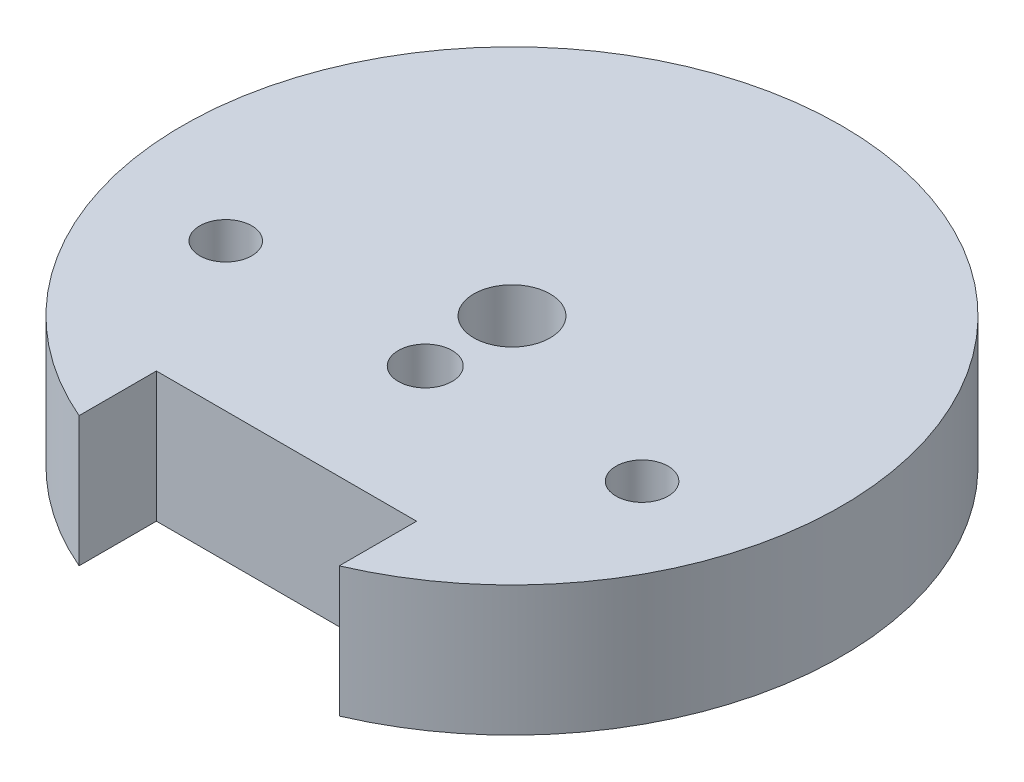
ISO-10303-21;
HEADER;
FILE_DESCRIPTION(('STEP AP214'),'2;1');
FILE_NAME('part.step','',(''),(''),'','','');
FILE_SCHEMA(('AUTOMOTIVE_DESIGN { 1 0 10303 214 1 1 1 1 }'));
ENDSEC;
DATA;
#1=APPLICATION_CONTEXT('core data for automotive mechanical design processes');
#2=APPLICATION_PROTOCOL_DEFINITION('international standard','automotive_design',2000,#1);
#3=PRODUCT_CONTEXT('',#1,'mechanical');
#4=PRODUCT('Part','Part','',(#3));
#5=PRODUCT_RELATED_PRODUCT_CATEGORY('part','',(#4));
#6=PRODUCT_DEFINITION_FORMATION('','',#4);
#7=PRODUCT_DEFINITION_CONTEXT('part definition',#1,'design');
#8=PRODUCT_DEFINITION('design','',#6,#7);
#9=PRODUCT_DEFINITION_SHAPE('','',#8);
#10=(LENGTH_UNIT() NAMED_UNIT(*) SI_UNIT(.MILLI.,.METRE.));
#11=(NAMED_UNIT(*) PLANE_ANGLE_UNIT() SI_UNIT($,.RADIAN.));
#12=(NAMED_UNIT(*) SI_UNIT($,.STERADIAN.) SOLID_ANGLE_UNIT());
#13=UNCERTAINTY_MEASURE_WITH_UNIT(LENGTH_MEASURE(1.E-05),#10,'distance_accuracy_value','');
#14=(GEOMETRIC_REPRESENTATION_CONTEXT(3) GLOBAL_UNCERTAINTY_ASSIGNED_CONTEXT((#13)) GLOBAL_UNIT_ASSIGNED_CONTEXT((#10,
#11,#12)) REPRESENTATION_CONTEXT('',''));
#15=CARTESIAN_POINT('',(0.,0.,0.));
#16=DIRECTION('',(0.,0.,1.));
#17=DIRECTION('',(1.,0.,0.));
#18=AXIS2_PLACEMENT_3D('',#15,#16,#17);
#19=CARTESIAN_POINT('',(0.,19.05,0.));
#20=DIRECTION('',(0.,1.,0.));
#21=DIRECTION('',(0.,0.,1.));
#22=AXIS2_PLACEMENT_3D('',#19,#20,#21);
#23=PLANE('',#22);
#24=CARTESIAN_POINT('',(30.48,19.05,11.43));
#25=DIRECTION('',(0.,1.,0.));
#26=DIRECTION('',(0.,0.,1.));
#27=AXIS2_PLACEMENT_3D('',#24,#25,#26);
#28=CIRCLE('',#27,3.81000000000002);
#29=CARTESIAN_POINT('',(30.48,19.05,7.61999999999997));
#30=VERTEX_POINT('',#29);
#31=EDGE_CURVE('E83',#30,#30,#28,.F.);
#32=ORIENTED_EDGE('',*,*,#31,.T.);
#33=EDGE_LOOP('',(#32));
#34=FACE_BOUND('',#33,.T.);
#35=CARTESIAN_POINT('',(-30.48,19.05,11.43));
#36=DIRECTION('',(0.,1.,0.));
#37=DIRECTION('',(0.,0.,1.));
#38=AXIS2_PLACEMENT_3D('',#35,#36,#37);
#39=CIRCLE('',#38,3.81000000000001);
#40=CARTESIAN_POINT('',(-30.48,19.05,7.61999999999999));
#41=VERTEX_POINT('',#40);
#42=EDGE_CURVE('E136',#41,#41,#39,.T.);
#43=ORIENTED_EDGE('',*,*,#42,.F.);
#44=EDGE_LOOP('',(#43));
#45=FACE_BOUND('',#44,.T.);
#46=CARTESIAN_POINT('',(0.,19.05,0.));
#47=DIRECTION('',(0.,1.,0.));
#48=DIRECTION('',(0.,0.,1.));
#49=AXIS2_PLACEMENT_3D('',#46,#47,#48);
#50=CIRCLE('',#49,5.588);
#51=CARTESIAN_POINT('',(0.,19.05,-5.588));
#52=VERTEX_POINT('',#51);
#53=EDGE_CURVE('E132',#52,#52,#50,.T.);
#54=ORIENTED_EDGE('',*,*,#53,.F.);
#55=EDGE_LOOP('',(#54));
#56=FACE_BOUND('',#55,.T.);
#57=CARTESIAN_POINT('',(0.,19.05,12.7));
#58=DIRECTION('',(0.,1.,0.));
#59=DIRECTION('',(0.,0.,1.));
#60=AXIS2_PLACEMENT_3D('',#57,#58,#59);
#61=CIRCLE('',#60,3.937);
#62=CARTESIAN_POINT('',(0.,19.05,8.763));
#63=VERTEX_POINT('',#62);
#64=EDGE_CURVE('E112',#63,#63,#61,.T.);
#65=ORIENTED_EDGE('',*,*,#64,.F.);
#66=EDGE_LOOP('',(#65));
#67=FACE_BOUND('',#66,.T.);
#68=CARTESIAN_POINT('',(0.,19.05,0.));
#69=DIRECTION('',(0.,1.,0.));
#70=DIRECTION('',(0.,0.,1.));
#71=AXIS2_PLACEMENT_3D('',#68,#69,#70);
#72=CIRCLE('',#71,48.26);
#73=CARTESIAN_POINT('',(-19.05,19.05,44.3410092352441));
#74=VERTEX_POINT('',#73);
#75=CARTESIAN_POINT('',(19.05,19.05,44.3410092352441));
#76=VERTEX_POINT('',#75);
#77=EDGE_CURVE('E151',#74,#76,#72,.F.);
#78=ORIENTED_EDGE('',*,*,#77,.F.);
#79=DIRECTION('',(0.,0.,1.));
#80=VECTOR('',#79,1.);
#81=CARTESIAN_POINT('',(-19.05,19.05,0.));
#82=LINE('',#81,#80);
#83=CARTESIAN_POINT('',(-19.05,19.05,33.02));
#84=VERTEX_POINT('',#83);
#85=EDGE_CURVE('E121',#84,#74,#82,.T.);
#86=ORIENTED_EDGE('',*,*,#85,.F.);
#87=DIRECTION('',(-1.,0.,0.));
#88=VECTOR('',#87,1.);
#89=CARTESIAN_POINT('',(0.,19.05,33.02));
#90=LINE('',#89,#88);
#91=CARTESIAN_POINT('',(19.05,19.05,33.02));
#92=VERTEX_POINT('',#91);
#93=EDGE_CURVE('E129',#92,#84,#90,.T.);
#94=ORIENTED_EDGE('',*,*,#93,.F.);
#95=DIRECTION('',(0.,0.,1.));
#96=VECTOR('',#95,1.);
#97=CARTESIAN_POINT('',(19.05,19.05,0.));
#98=LINE('',#97,#96);
#99=EDGE_CURVE('E80',#92,#76,#98,.T.);
#100=ORIENTED_EDGE('',*,*,#99,.T.);
#101=EDGE_LOOP('',(#78,#86,#94,#100));
#102=FACE_BOUND('',#101,.T.);
#103=ADVANCED_FACE('F41',(#34,#45,#56,#67,#102),#23,.T.);
#104=CARTESIAN_POINT('',(0.,0.,0.));
#105=DIRECTION('',(0.,1.,0.));
#106=DIRECTION('',(0.,0.,1.));
#107=AXIS2_PLACEMENT_3D('',#104,#105,#106);
#108=PLANE('',#107);
#109=CARTESIAN_POINT('',(0.,0.,12.7));
#110=DIRECTION('',(0.,1.,0.));
#111=DIRECTION('',(0.,0.,1.));
#112=AXIS2_PLACEMENT_3D('',#109,#110,#111);
#113=CIRCLE('',#112,3.937);
#114=CARTESIAN_POINT('',(0.,0.,8.763));
#115=VERTEX_POINT('',#114);
#116=EDGE_CURVE('E92',#115,#115,#113,.T.);
#117=ORIENTED_EDGE('',*,*,#116,.T.);
#118=EDGE_LOOP('',(#117));
#119=FACE_BOUND('',#118,.T.);
#120=CARTESIAN_POINT('',(0.,0.,0.));
#121=DIRECTION('',(0.,1.,0.));
#122=DIRECTION('',(0.,0.,1.));
#123=AXIS2_PLACEMENT_3D('',#120,#121,#122);
#124=CIRCLE('',#123,5.588);
#125=CARTESIAN_POINT('',(0.,0.,-5.588));
#126=VERTEX_POINT('',#125);
#127=EDGE_CURVE('E97',#126,#126,#124,.T.);
#128=ORIENTED_EDGE('',*,*,#127,.T.);
#129=EDGE_LOOP('',(#128));
#130=FACE_BOUND('',#129,.T.);
#131=CARTESIAN_POINT('',(-30.48,0.,11.43));
#132=DIRECTION('',(0.,1.,0.));
#133=DIRECTION('',(0.,0.,1.));
#134=AXIS2_PLACEMENT_3D('',#131,#132,#133);
#135=CIRCLE('',#134,3.81000000000001);
#136=CARTESIAN_POINT('',(-30.48,0.,7.61999999999999));
#137=VERTEX_POINT('',#136);
#138=EDGE_CURVE('E102',#137,#137,#135,.T.);
#139=ORIENTED_EDGE('',*,*,#138,.T.);
#140=EDGE_LOOP('',(#139));
#141=FACE_BOUND('',#140,.T.);
#142=CARTESIAN_POINT('',(30.48,0.,11.43));
#143=DIRECTION('',(0.,1.,0.));
#144=DIRECTION('',(0.,0.,1.));
#145=AXIS2_PLACEMENT_3D('',#142,#143,#144);
#146=CIRCLE('',#145,3.81000000000002);
#147=CARTESIAN_POINT('',(30.48,0.,7.61999999999997));
#148=VERTEX_POINT('',#147);
#149=EDGE_CURVE('E109',#148,#148,#146,.F.);
#150=ORIENTED_EDGE('',*,*,#149,.F.);
#151=EDGE_LOOP('',(#150));
#152=FACE_BOUND('',#151,.T.);
#153=DIRECTION('',(0.,0.,1.));
#154=VECTOR('',#153,1.);
#155=CARTESIAN_POINT('',(-19.05,0.,0.));
#156=LINE('',#155,#154);
#157=CARTESIAN_POINT('',(-19.05,0.,33.02));
#158=VERTEX_POINT('',#157);
#159=CARTESIAN_POINT('',(-19.05,0.,44.3410092352441));
#160=VERTEX_POINT('',#159);
#161=EDGE_CURVE('E91',#158,#160,#156,.T.);
#162=ORIENTED_EDGE('',*,*,#161,.T.);
#163=CARTESIAN_POINT('',(0.,0.,0.));
#164=DIRECTION('',(0.,1.,0.));
#165=DIRECTION('',(0.,0.,1.));
#166=AXIS2_PLACEMENT_3D('',#163,#164,#165);
#167=CIRCLE('',#166,48.26);
#168=CARTESIAN_POINT('',(19.05,0.,44.3410092352441));
#169=VERTEX_POINT('',#168);
#170=EDGE_CURVE('E89',#169,#160,#167,.T.);
#171=ORIENTED_EDGE('',*,*,#170,.F.);
#172=DIRECTION('',(0.,0.,1.));
#173=VECTOR('',#172,1.);
#174=CARTESIAN_POINT('',(19.05,0.,0.));
#175=LINE('',#174,#173);
#176=CARTESIAN_POINT('',(19.05,0.,33.02));
#177=VERTEX_POINT('',#176);
#178=EDGE_CURVE('E78',#177,#169,#175,.T.);
#179=ORIENTED_EDGE('',*,*,#178,.F.);
#180=DIRECTION('',(-1.,0.,0.));
#181=VECTOR('',#180,1.);
#182=CARTESIAN_POINT('',(0.,0.,33.02));
#183=LINE('',#182,#181);
#184=EDGE_CURVE('E88',#177,#158,#183,.T.);
#185=ORIENTED_EDGE('',*,*,#184,.T.);
#186=EDGE_LOOP('',(#162,#171,#179,#185));
#187=FACE_BOUND('',#186,.T.);
#188=ADVANCED_FACE('F87',(#119,#130,#141,#152,#187),#108,.F.);
#189=CARTESIAN_POINT('',(19.05,19.05,0.));
#190=DIRECTION('',(1.,0.,0.));
#191=DIRECTION('',(0.,0.,-1.));
#192=AXIS2_PLACEMENT_3D('',#189,#190,#191);
#193=PLANE('',#192);
#194=ORIENTED_EDGE('',*,*,#178,.T.);
#195=DIRECTION('',(0.,-1.,0.));
#196=VECTOR('',#195,1.);
#197=CARTESIAN_POINT('',(19.05,63.5,44.3410092352441));
#198=LINE('',#197,#196);
#199=EDGE_CURVE('E57',#169,#76,#198,.F.);
#200=ORIENTED_EDGE('',*,*,#199,.T.);
#201=ORIENTED_EDGE('',*,*,#99,.F.);
#202=DIRECTION('',(0.,-1.,0.));
#203=VECTOR('',#202,1.);
#204=CARTESIAN_POINT('',(19.05,19.05,33.02));
#205=LINE('',#204,#203);
#206=EDGE_CURVE('E50',#92,#177,#205,.T.);
#207=ORIENTED_EDGE('',*,*,#206,.T.);
#208=EDGE_LOOP('',(#194,#200,#201,#207));
#209=FACE_BOUND('',#208,.T.);
#210=ADVANCED_FACE('F77',(#209),#193,.F.);
#211=CARTESIAN_POINT('',(-19.05,19.05,0.));
#212=DIRECTION('',(1.,0.,0.));
#213=DIRECTION('',(0.,0.,-1.));
#214=AXIS2_PLACEMENT_3D('',#211,#212,#213);
#215=PLANE('',#214);
#216=DIRECTION('',(0.,-1.,0.));
#217=VECTOR('',#216,1.);
#218=CARTESIAN_POINT('',(-19.05,63.5,44.3410092352441));
#219=LINE('',#218,#217);
#220=EDGE_CURVE('E148',#160,#74,#219,.F.);
#221=ORIENTED_EDGE('',*,*,#220,.F.);
#222=ORIENTED_EDGE('',*,*,#161,.F.);
#223=DIRECTION('',(0.,-1.,0.));
#224=VECTOR('',#223,1.);
#225=CARTESIAN_POINT('',(-19.05,19.05,33.02));
#226=LINE('',#225,#224);
#227=EDGE_CURVE('E11',#84,#158,#226,.T.);
#228=ORIENTED_EDGE('',*,*,#227,.F.);
#229=ORIENTED_EDGE('',*,*,#85,.T.);
#230=EDGE_LOOP('',(#221,#222,#228,#229));
#231=FACE_BOUND('',#230,.T.);
#232=ADVANCED_FACE('F163',(#231),#215,.T.);
#233=CARTESIAN_POINT('',(-30.48,19.05,11.43));
#234=DIRECTION('',(0.,-1.,0.));
#235=DIRECTION('',(0.,0.,-1.));
#236=AXIS2_PLACEMENT_3D('',#233,#234,#235);
#237=CYLINDRICAL_SURFACE('',#236,3.81000000000001);
#238=CARTESIAN_POINT('',(-30.48,19.05,7.61999999999999));
#239=CARTESIAN_POINT('',(-30.48,18.8515625,7.61999999999999));
#240=CARTESIAN_POINT('',(-30.48,18.653125,7.61999999999999));
#241=CARTESIAN_POINT('',(-30.48,18.25625,7.61999999999999));
#242=CARTESIAN_POINT('',(-30.48,18.0578125,7.61999999999999));
#243=CARTESIAN_POINT('',(-30.48,17.6609375,7.61999999999999));
#244=CARTESIAN_POINT('',(-30.48,17.4625,7.61999999999999));
#245=CARTESIAN_POINT('',(-30.48,17.065625,7.61999999999999));
#246=CARTESIAN_POINT('',(-30.48,16.8671875,7.61999999999999));
#247=CARTESIAN_POINT('',(-30.48,16.4703125,7.61999999999999));
#248=CARTESIAN_POINT('',(-30.48,16.271875,7.61999999999999));
#249=CARTESIAN_POINT('',(-30.48,15.875,7.61999999999999));
#250=CARTESIAN_POINT('',(-30.48,15.6765625,7.61999999999999));
#251=CARTESIAN_POINT('',(-30.48,15.2796875,7.61999999999999));
#252=CARTESIAN_POINT('',(-30.48,15.08125,7.61999999999999));
#253=CARTESIAN_POINT('',(-30.48,14.684375,7.61999999999999));
#254=CARTESIAN_POINT('',(-30.48,14.4859375,7.61999999999999));
#255=CARTESIAN_POINT('',(-30.48,14.0890625,7.61999999999999));
#256=CARTESIAN_POINT('',(-30.48,13.890625,7.61999999999999));
#257=CARTESIAN_POINT('',(-30.48,13.49375,7.61999999999999));
#258=CARTESIAN_POINT('',(-30.48,13.2953125,7.61999999999999));
#259=CARTESIAN_POINT('',(-30.48,12.8984375,7.61999999999999));
#260=CARTESIAN_POINT('',(-30.48,12.7,7.61999999999999));
#261=CARTESIAN_POINT('',(-30.48,12.303125,7.61999999999999));
#262=CARTESIAN_POINT('',(-30.48,12.1046875,7.61999999999999));
#263=CARTESIAN_POINT('',(-30.48,11.7078125,7.61999999999999));
#264=CARTESIAN_POINT('',(-30.48,11.509375,7.61999999999999));
#265=CARTESIAN_POINT('',(-30.48,11.1125,7.61999999999999));
#266=CARTESIAN_POINT('',(-30.48,10.9140625,7.61999999999999));
#267=CARTESIAN_POINT('',(-30.48,10.5171875,7.61999999999999));
#268=CARTESIAN_POINT('',(-30.48,10.31875,7.61999999999999));
#269=CARTESIAN_POINT('',(-30.48,9.921875,7.61999999999999));
#270=CARTESIAN_POINT('',(-30.48,9.7234375,7.61999999999999));
#271=CARTESIAN_POINT('',(-30.48,9.3265625,7.61999999999999));
#272=CARTESIAN_POINT('',(-30.48,9.128125,7.61999999999999));
#273=CARTESIAN_POINT('',(-30.48,8.73125,7.61999999999999));
#274=CARTESIAN_POINT('',(-30.48,8.5328125,7.61999999999999));
#275=CARTESIAN_POINT('',(-30.48,8.1359375,7.61999999999999));
#276=CARTESIAN_POINT('',(-30.48,7.9375,7.61999999999999));
#277=CARTESIAN_POINT('',(-30.48,7.540625,7.61999999999999));
#278=CARTESIAN_POINT('',(-30.48,7.3421875,7.61999999999999));
#279=CARTESIAN_POINT('',(-30.48,6.9453125,7.61999999999999));
#280=CARTESIAN_POINT('',(-30.48,6.746875,7.61999999999999));
#281=CARTESIAN_POINT('',(-30.48,6.35,7.61999999999999));
#282=CARTESIAN_POINT('',(-30.48,6.1515625,7.61999999999999));
#283=CARTESIAN_POINT('',(-30.48,5.7546875,7.61999999999999));
#284=CARTESIAN_POINT('',(-30.48,5.55625,7.61999999999999));
#285=CARTESIAN_POINT('',(-30.48,5.159375,7.61999999999999));
#286=CARTESIAN_POINT('',(-30.48,4.9609375,7.61999999999999));
#287=CARTESIAN_POINT('',(-30.48,4.5640625,7.61999999999999));
#288=CARTESIAN_POINT('',(-30.48,4.365625,7.61999999999999));
#289=CARTESIAN_POINT('',(-30.48,3.96875,7.61999999999999));
#290=CARTESIAN_POINT('',(-30.48,3.7703125,7.61999999999999));
#291=CARTESIAN_POINT('',(-30.48,3.3734375,7.61999999999999));
#292=CARTESIAN_POINT('',(-30.48,3.175,7.61999999999999));
#293=CARTESIAN_POINT('',(-30.48,2.778125,7.61999999999999));
#294=CARTESIAN_POINT('',(-30.48,2.5796875,7.61999999999999));
#295=CARTESIAN_POINT('',(-30.48,2.1828125,7.61999999999999));
#296=CARTESIAN_POINT('',(-30.48,1.984375,7.61999999999999));
#297=CARTESIAN_POINT('',(-30.48,1.5875,7.61999999999999));
#298=CARTESIAN_POINT('',(-30.48,1.3890625,7.61999999999999));
#299=CARTESIAN_POINT('',(-30.48,0.992187500000001,7.61999999999999));
#300=CARTESIAN_POINT('',(-30.48,0.793750000000001,7.61999999999999));
#301=CARTESIAN_POINT('',(-30.48,0.396875,7.61999999999999));
#302=CARTESIAN_POINT('',(-30.48,0.1984375,7.61999999999999));
#303=CARTESIAN_POINT('',(-30.48,0.,7.61999999999999));
#304=B_SPLINE_CURVE_WITH_KNOTS('',3,(#238,#239,#240,#241,#242,#243,#244,#245,#246,#247,#248,
#249,#250,#251,#252,#253,#254,#255,#256,#257,#258,#259,#260,#261,#262,#263,#264,#265,#266,#267,
#268,#269,#270,#271,#272,#273,#274,#275,#276,#277,#278,#279,#280,#281,#282,#283,#284,#285,#286,
#287,#288,#289,#290,#291,#292,#293,#294,#295,#296,#297,#298,#299,#300,#301,#302,#303),
.UNSPECIFIED.,.F.,.F.,(4,2,2,2,2,2,2,2,2,2,2,2,2,2,2,2,2,2,2,2,2,2,2,2,2,2,2,2,2,2,2,2,4),(0.,
0.5953125,1.190625,1.7859375,2.38125,2.9765625,3.571875,4.1671875,4.7625,5.3578125,5.953125,
6.5484375,7.14375,7.7390625,8.334375,8.9296875,9.525,10.1203125,10.715625,11.3109375,11.90625,
12.5015625,13.096875,13.6921875,14.2875,14.8828125,15.478125,16.0734375,16.66875,17.2640625,
17.859375,18.4546875,19.05),.UNSPECIFIED.);
#305=EDGE_CURVE('BSEAM181',#41,#137,#304,.T.);
#306=ORIENTED_EDGE('',*,*,#42,.T.);
#307=ORIENTED_EDGE('',*,*,#138,.F.);
#308=ORIENTED_EDGE('',*,*,#305,.T.);
#309=ORIENTED_EDGE('',*,*,#305,.F.);
#310=EDGE_LOOP('',(#306,#308,#307,#309));
#311=FACE_BOUND('',#310,.T.);
#312=ADVANCED_FACE('F181',(#311),#237,.F.);
#313=CARTESIAN_POINT('',(0.,19.05,0.));
#314=DIRECTION('',(0.,-1.,0.));
#315=DIRECTION('',(0.,0.,-1.));
#316=AXIS2_PLACEMENT_3D('',#313,#314,#315);
#317=CYLINDRICAL_SURFACE('',#316,5.588);
#318=CARTESIAN_POINT('',(0.,19.05,-5.588));
#319=CARTESIAN_POINT('',(0.,18.8515625,-5.588));
#320=CARTESIAN_POINT('',(0.,18.653125,-5.588));
#321=CARTESIAN_POINT('',(0.,18.25625,-5.588));
#322=CARTESIAN_POINT('',(0.,18.0578125,-5.588));
#323=CARTESIAN_POINT('',(0.,17.6609375,-5.588));
#324=CARTESIAN_POINT('',(0.,17.4625,-5.588));
#325=CARTESIAN_POINT('',(0.,17.065625,-5.588));
#326=CARTESIAN_POINT('',(0.,16.8671875,-5.588));
#327=CARTESIAN_POINT('',(0.,16.4703125,-5.588));
#328=CARTESIAN_POINT('',(0.,16.271875,-5.588));
#329=CARTESIAN_POINT('',(0.,15.875,-5.588));
#330=CARTESIAN_POINT('',(0.,15.6765625,-5.588));
#331=CARTESIAN_POINT('',(0.,15.2796875,-5.588));
#332=CARTESIAN_POINT('',(0.,15.08125,-5.588));
#333=CARTESIAN_POINT('',(0.,14.684375,-5.588));
#334=CARTESIAN_POINT('',(0.,14.4859375,-5.588));
#335=CARTESIAN_POINT('',(0.,14.0890625,-5.588));
#336=CARTESIAN_POINT('',(0.,13.890625,-5.588));
#337=CARTESIAN_POINT('',(0.,13.49375,-5.588));
#338=CARTESIAN_POINT('',(0.,13.2953125,-5.588));
#339=CARTESIAN_POINT('',(0.,12.8984375,-5.588));
#340=CARTESIAN_POINT('',(0.,12.7,-5.588));
#341=CARTESIAN_POINT('',(0.,12.303125,-5.588));
#342=CARTESIAN_POINT('',(0.,12.1046875,-5.588));
#343=CARTESIAN_POINT('',(0.,11.7078125,-5.588));
#344=CARTESIAN_POINT('',(0.,11.509375,-5.588));
#345=CARTESIAN_POINT('',(0.,11.1125,-5.588));
#346=CARTESIAN_POINT('',(0.,10.9140625,-5.588));
#347=CARTESIAN_POINT('',(0.,10.5171875,-5.588));
#348=CARTESIAN_POINT('',(0.,10.31875,-5.588));
#349=CARTESIAN_POINT('',(0.,9.921875,-5.588));
#350=CARTESIAN_POINT('',(0.,9.7234375,-5.588));
#351=CARTESIAN_POINT('',(0.,9.3265625,-5.588));
#352=CARTESIAN_POINT('',(0.,9.128125,-5.588));
#353=CARTESIAN_POINT('',(0.,8.73125,-5.588));
#354=CARTESIAN_POINT('',(0.,8.5328125,-5.588));
#355=CARTESIAN_POINT('',(0.,8.1359375,-5.588));
#356=CARTESIAN_POINT('',(0.,7.9375,-5.588));
#357=CARTESIAN_POINT('',(0.,7.540625,-5.588));
#358=CARTESIAN_POINT('',(0.,7.3421875,-5.588));
#359=CARTESIAN_POINT('',(0.,6.9453125,-5.588));
#360=CARTESIAN_POINT('',(0.,6.746875,-5.588));
#361=CARTESIAN_POINT('',(0.,6.35,-5.588));
#362=CARTESIAN_POINT('',(0.,6.1515625,-5.588));
#363=CARTESIAN_POINT('',(0.,5.7546875,-5.588));
#364=CARTESIAN_POINT('',(0.,5.55625,-5.588));
#365=CARTESIAN_POINT('',(0.,5.159375,-5.588));
#366=CARTESIAN_POINT('',(0.,4.9609375,-5.588));
#367=CARTESIAN_POINT('',(0.,4.5640625,-5.588));
#368=CARTESIAN_POINT('',(0.,4.365625,-5.588));
#369=CARTESIAN_POINT('',(0.,3.96875,-5.588));
#370=CARTESIAN_POINT('',(0.,3.7703125,-5.588));
#371=CARTESIAN_POINT('',(0.,3.3734375,-5.588));
#372=CARTESIAN_POINT('',(0.,3.175,-5.588));
#373=CARTESIAN_POINT('',(0.,2.778125,-5.588));
#374=CARTESIAN_POINT('',(0.,2.5796875,-5.588));
#375=CARTESIAN_POINT('',(0.,2.1828125,-5.588));
#376=CARTESIAN_POINT('',(0.,1.984375,-5.588));
#377=CARTESIAN_POINT('',(0.,1.5875,-5.588));
#378=CARTESIAN_POINT('',(0.,1.3890625,-5.588));
#379=CARTESIAN_POINT('',(0.,0.992187500000001,-5.588));
#380=CARTESIAN_POINT('',(0.,0.793750000000001,-5.588));
#381=CARTESIAN_POINT('',(0.,0.396875,-5.588));
#382=CARTESIAN_POINT('',(0.,0.1984375,-5.588));
#383=CARTESIAN_POINT('',(0.,0.,-5.588));
#384=B_SPLINE_CURVE_WITH_KNOTS('',3,(#318,#319,#320,#321,#322,#323,#324,#325,#326,#327,#328,
#329,#330,#331,#332,#333,#334,#335,#336,#337,#338,#339,#340,#341,#342,#343,#344,#345,#346,#347,
#348,#349,#350,#351,#352,#353,#354,#355,#356,#357,#358,#359,#360,#361,#362,#363,#364,#365,#366,
#367,#368,#369,#370,#371,#372,#373,#374,#375,#376,#377,#378,#379,#380,#381,#382,#383),
.UNSPECIFIED.,.F.,.F.,(4,2,2,2,2,2,2,2,2,2,2,2,2,2,2,2,2,2,2,2,2,2,2,2,2,2,2,2,2,2,2,2,4),(0.,
0.5953125,1.190625,1.7859375,2.38125,2.9765625,3.571875,4.1671875,4.7625,5.3578125,5.953125,
6.5484375,7.14375,7.7390625,8.334375,8.9296875,9.525,10.1203125,10.715625,11.3109375,11.90625,
12.5015625,13.096875,13.6921875,14.2875,14.8828125,15.478125,16.0734375,16.66875,17.2640625,
17.859375,18.4546875,19.05),.UNSPECIFIED.);
#385=EDGE_CURVE('BSEAM184',#52,#126,#384,.T.);
#386=ORIENTED_EDGE('',*,*,#53,.T.);
#387=ORIENTED_EDGE('',*,*,#127,.F.);
#388=ORIENTED_EDGE('',*,*,#385,.T.);
#389=ORIENTED_EDGE('',*,*,#385,.F.);
#390=EDGE_LOOP('',(#386,#388,#387,#389));
#391=FACE_BOUND('',#390,.T.);
#392=ADVANCED_FACE('F184',(#391),#317,.F.);
#393=CARTESIAN_POINT('',(0.,19.05,33.02));
#394=DIRECTION('',(0.,0.,1.));
#395=DIRECTION('',(1.,0.,0.));
#396=AXIS2_PLACEMENT_3D('',#393,#394,#395);
#397=PLANE('',#396);
#398=ORIENTED_EDGE('',*,*,#184,.F.);
#399=ORIENTED_EDGE('',*,*,#206,.F.);
#400=ORIENTED_EDGE('',*,*,#93,.T.);
#401=ORIENTED_EDGE('',*,*,#227,.T.);
#402=EDGE_LOOP('',(#398,#399,#400,#401));
#403=FACE_BOUND('',#402,.T.);
#404=ADVANCED_FACE('F94',(#403),#397,.T.);
#405=CARTESIAN_POINT('',(0.,19.05,12.7));
#406=DIRECTION('',(0.,-1.,0.));
#407=DIRECTION('',(0.,0.,-1.));
#408=AXIS2_PLACEMENT_3D('',#405,#406,#407);
#409=CYLINDRICAL_SURFACE('',#408,3.937);
#410=CARTESIAN_POINT('',(0.,19.05,8.763));
#411=CARTESIAN_POINT('',(0.,18.8515625,8.763));
#412=CARTESIAN_POINT('',(0.,18.653125,8.763));
#413=CARTESIAN_POINT('',(0.,18.25625,8.763));
#414=CARTESIAN_POINT('',(0.,18.0578125,8.763));
#415=CARTESIAN_POINT('',(0.,17.6609375,8.763));
#416=CARTESIAN_POINT('',(0.,17.4625,8.763));
#417=CARTESIAN_POINT('',(0.,17.065625,8.763));
#418=CARTESIAN_POINT('',(0.,16.8671875,8.763));
#419=CARTESIAN_POINT('',(0.,16.4703125,8.763));
#420=CARTESIAN_POINT('',(0.,16.271875,8.763));
#421=CARTESIAN_POINT('',(0.,15.875,8.763));
#422=CARTESIAN_POINT('',(0.,15.6765625,8.763));
#423=CARTESIAN_POINT('',(0.,15.2796875,8.763));
#424=CARTESIAN_POINT('',(0.,15.08125,8.763));
#425=CARTESIAN_POINT('',(0.,14.684375,8.763));
#426=CARTESIAN_POINT('',(0.,14.4859375,8.763));
#427=CARTESIAN_POINT('',(0.,14.0890625,8.763));
#428=CARTESIAN_POINT('',(0.,13.890625,8.763));
#429=CARTESIAN_POINT('',(0.,13.49375,8.763));
#430=CARTESIAN_POINT('',(0.,13.2953125,8.763));
#431=CARTESIAN_POINT('',(0.,12.8984375,8.763));
#432=CARTESIAN_POINT('',(0.,12.7,8.763));
#433=CARTESIAN_POINT('',(0.,12.303125,8.763));
#434=CARTESIAN_POINT('',(0.,12.1046875,8.763));
#435=CARTESIAN_POINT('',(0.,11.7078125,8.763));
#436=CARTESIAN_POINT('',(0.,11.509375,8.763));
#437=CARTESIAN_POINT('',(0.,11.1125,8.763));
#438=CARTESIAN_POINT('',(0.,10.9140625,8.763));
#439=CARTESIAN_POINT('',(0.,10.5171875,8.763));
#440=CARTESIAN_POINT('',(0.,10.31875,8.763));
#441=CARTESIAN_POINT('',(0.,9.921875,8.763));
#442=CARTESIAN_POINT('',(0.,9.7234375,8.763));
#443=CARTESIAN_POINT('',(0.,9.3265625,8.763));
#444=CARTESIAN_POINT('',(0.,9.128125,8.763));
#445=CARTESIAN_POINT('',(0.,8.73125,8.763));
#446=CARTESIAN_POINT('',(0.,8.5328125,8.763));
#447=CARTESIAN_POINT('',(0.,8.1359375,8.763));
#448=CARTESIAN_POINT('',(0.,7.9375,8.763));
#449=CARTESIAN_POINT('',(0.,7.540625,8.763));
#450=CARTESIAN_POINT('',(0.,7.3421875,8.763));
#451=CARTESIAN_POINT('',(0.,6.9453125,8.763));
#452=CARTESIAN_POINT('',(0.,6.746875,8.763));
#453=CARTESIAN_POINT('',(0.,6.35,8.763));
#454=CARTESIAN_POINT('',(0.,6.1515625,8.763));
#455=CARTESIAN_POINT('',(0.,5.7546875,8.763));
#456=CARTESIAN_POINT('',(0.,5.55625,8.763));
#457=CARTESIAN_POINT('',(0.,5.159375,8.763));
#458=CARTESIAN_POINT('',(0.,4.9609375,8.763));
#459=CARTESIAN_POINT('',(0.,4.5640625,8.763));
#460=CARTESIAN_POINT('',(0.,4.365625,8.763));
#461=CARTESIAN_POINT('',(0.,3.96875,8.763));
#462=CARTESIAN_POINT('',(0.,3.7703125,8.763));
#463=CARTESIAN_POINT('',(0.,3.3734375,8.763));
#464=CARTESIAN_POINT('',(0.,3.175,8.763));
#465=CARTESIAN_POINT('',(0.,2.778125,8.763));
#466=CARTESIAN_POINT('',(0.,2.5796875,8.763));
#467=CARTESIAN_POINT('',(0.,2.1828125,8.763));
#468=CARTESIAN_POINT('',(0.,1.984375,8.763));
#469=CARTESIAN_POINT('',(0.,1.5875,8.763));
#470=CARTESIAN_POINT('',(0.,1.3890625,8.763));
#471=CARTESIAN_POINT('',(0.,0.992187500000001,8.763));
#472=CARTESIAN_POINT('',(0.,0.793750000000001,8.763));
#473=CARTESIAN_POINT('',(0.,0.396875,8.763));
#474=CARTESIAN_POINT('',(0.,0.1984375,8.763));
#475=CARTESIAN_POINT('',(0.,0.,8.763));
#476=B_SPLINE_CURVE_WITH_KNOTS('',3,(#410,#411,#412,#413,#414,#415,#416,#417,#418,#419,#420,
#421,#422,#423,#424,#425,#426,#427,#428,#429,#430,#431,#432,#433,#434,#435,#436,#437,#438,#439,
#440,#441,#442,#443,#444,#445,#446,#447,#448,#449,#450,#451,#452,#453,#454,#455,#456,#457,#458,
#459,#460,#461,#462,#463,#464,#465,#466,#467,#468,#469,#470,#471,#472,#473,#474,#475),
.UNSPECIFIED.,.F.,.F.,(4,2,2,2,2,2,2,2,2,2,2,2,2,2,2,2,2,2,2,2,2,2,2,2,2,2,2,2,2,2,2,2,4),(0.,
0.595312499999997,1.190625,1.7859375,2.38125,2.9765625,3.571875,4.1671875,4.7625,5.3578125,
5.953125,6.5484375,7.14375,7.7390625,8.334375,8.9296875,9.525,10.1203125,10.715625,11.3109375,
11.90625,12.5015625,13.096875,13.6921875,14.2875,14.8828125,15.478125,16.0734375,16.66875,
17.2640625,17.859375,18.4546875,19.05),.UNSPECIFIED.);
#477=EDGE_CURVE('BSEAM43',#63,#115,#476,.T.);
#478=ORIENTED_EDGE('',*,*,#64,.T.);
#479=ORIENTED_EDGE('',*,*,#116,.F.);
#480=ORIENTED_EDGE('',*,*,#477,.T.);
#481=ORIENTED_EDGE('',*,*,#477,.F.);
#482=EDGE_LOOP('',(#478,#480,#479,#481));
#483=FACE_BOUND('',#482,.T.);
#484=ADVANCED_FACE('F43',(#483),#409,.F.);
#485=CARTESIAN_POINT('',(30.48,19.05,11.43));
#486=DIRECTION('',(0.,-1.,0.));
#487=DIRECTION('',(0.,0.,-1.));
#488=AXIS2_PLACEMENT_3D('',#485,#486,#487);
#489=CYLINDRICAL_SURFACE('',#488,3.81000000000002);
#490=CARTESIAN_POINT('',(30.48,19.05,7.61999999999997));
#491=CARTESIAN_POINT('',(30.48,18.8515625,7.61999999999997));
#492=CARTESIAN_POINT('',(30.48,18.653125,7.61999999999997));
#493=CARTESIAN_POINT('',(30.48,18.25625,7.61999999999997));
#494=CARTESIAN_POINT('',(30.48,18.0578125,7.61999999999997));
#495=CARTESIAN_POINT('',(30.48,17.6609375,7.61999999999997));
#496=CARTESIAN_POINT('',(30.48,17.4625,7.61999999999997));
#497=CARTESIAN_POINT('',(30.48,17.065625,7.61999999999997));
#498=CARTESIAN_POINT('',(30.48,16.8671875,7.61999999999997));
#499=CARTESIAN_POINT('',(30.48,16.4703125,7.61999999999997));
#500=CARTESIAN_POINT('',(30.48,16.271875,7.61999999999997));
#501=CARTESIAN_POINT('',(30.48,15.875,7.61999999999997));
#502=CARTESIAN_POINT('',(30.48,15.6765625,7.61999999999997));
#503=CARTESIAN_POINT('',(30.48,15.2796875,7.61999999999997));
#504=CARTESIAN_POINT('',(30.48,15.08125,7.61999999999997));
#505=CARTESIAN_POINT('',(30.48,14.684375,7.61999999999997));
#506=CARTESIAN_POINT('',(30.48,14.4859375,7.61999999999997));
#507=CARTESIAN_POINT('',(30.48,14.0890625,7.61999999999997));
#508=CARTESIAN_POINT('',(30.48,13.890625,7.61999999999997));
#509=CARTESIAN_POINT('',(30.48,13.49375,7.61999999999997));
#510=CARTESIAN_POINT('',(30.48,13.2953125,7.61999999999997));
#511=CARTESIAN_POINT('',(30.48,12.8984375,7.61999999999997));
#512=CARTESIAN_POINT('',(30.48,12.7,7.61999999999997));
#513=CARTESIAN_POINT('',(30.48,12.303125,7.61999999999997));
#514=CARTESIAN_POINT('',(30.48,12.1046875,7.61999999999997));
#515=CARTESIAN_POINT('',(30.48,11.7078125,7.61999999999997));
#516=CARTESIAN_POINT('',(30.48,11.509375,7.61999999999997));
#517=CARTESIAN_POINT('',(30.48,11.1125,7.61999999999997));
#518=CARTESIAN_POINT('',(30.48,10.9140625,7.61999999999997));
#519=CARTESIAN_POINT('',(30.48,10.5171875,7.61999999999997));
#520=CARTESIAN_POINT('',(30.48,10.31875,7.61999999999997));
#521=CARTESIAN_POINT('',(30.48,9.921875,7.61999999999997));
#522=CARTESIAN_POINT('',(30.48,9.7234375,7.61999999999997));
#523=CARTESIAN_POINT('',(30.48,9.3265625,7.61999999999997));
#524=CARTESIAN_POINT('',(30.48,9.128125,7.61999999999997));
#525=CARTESIAN_POINT('',(30.48,8.73125,7.61999999999997));
#526=CARTESIAN_POINT('',(30.48,8.5328125,7.61999999999997));
#527=CARTESIAN_POINT('',(30.48,8.1359375,7.61999999999997));
#528=CARTESIAN_POINT('',(30.48,7.9375,7.61999999999997));
#529=CARTESIAN_POINT('',(30.48,7.540625,7.61999999999997));
#530=CARTESIAN_POINT('',(30.48,7.3421875,7.61999999999997));
#531=CARTESIAN_POINT('',(30.48,6.9453125,7.61999999999997));
#532=CARTESIAN_POINT('',(30.48,6.746875,7.61999999999997));
#533=CARTESIAN_POINT('',(30.48,6.35,7.61999999999997));
#534=CARTESIAN_POINT('',(30.48,6.1515625,7.61999999999997));
#535=CARTESIAN_POINT('',(30.48,5.7546875,7.61999999999997));
#536=CARTESIAN_POINT('',(30.48,5.55625,7.61999999999997));
#537=CARTESIAN_POINT('',(30.48,5.159375,7.61999999999997));
#538=CARTESIAN_POINT('',(30.48,4.9609375,7.61999999999997));
#539=CARTESIAN_POINT('',(30.48,4.5640625,7.61999999999997));
#540=CARTESIAN_POINT('',(30.48,4.365625,7.61999999999997));
#541=CARTESIAN_POINT('',(30.48,3.96875,7.61999999999997));
#542=CARTESIAN_POINT('',(30.48,3.7703125,7.61999999999997));
#543=CARTESIAN_POINT('',(30.48,3.3734375,7.61999999999997));
#544=CARTESIAN_POINT('',(30.48,3.175,7.61999999999997));
#545=CARTESIAN_POINT('',(30.48,2.778125,7.61999999999997));
#546=CARTESIAN_POINT('',(30.48,2.5796875,7.61999999999997));
#547=CARTESIAN_POINT('',(30.48,2.1828125,7.61999999999997));
#548=CARTESIAN_POINT('',(30.48,1.984375,7.61999999999997));
#549=CARTESIAN_POINT('',(30.48,1.5875,7.61999999999997));
#550=CARTESIAN_POINT('',(30.48,1.3890625,7.61999999999997));
#551=CARTESIAN_POINT('',(30.48,0.992187500000001,7.61999999999997));
#552=CARTESIAN_POINT('',(30.48,0.793750000000001,7.61999999999997));
#553=CARTESIAN_POINT('',(30.48,0.396875,7.61999999999997));
#554=CARTESIAN_POINT('',(30.48,0.1984375,7.61999999999997));
#555=CARTESIAN_POINT('',(30.48,0.,7.61999999999997));
#556=B_SPLINE_CURVE_WITH_KNOTS('',3,(#490,#491,#492,#493,#494,#495,#496,#497,#498,#499,#500,
#501,#502,#503,#504,#505,#506,#507,#508,#509,#510,#511,#512,#513,#514,#515,#516,#517,#518,#519,
#520,#521,#522,#523,#524,#525,#526,#527,#528,#529,#530,#531,#532,#533,#534,#535,#536,#537,#538,
#539,#540,#541,#542,#543,#544,#545,#546,#547,#548,#549,#550,#551,#552,#553,#554,#555),
.UNSPECIFIED.,.F.,.F.,(4,2,2,2,2,2,2,2,2,2,2,2,2,2,2,2,2,2,2,2,2,2,2,2,2,2,2,2,2,2,2,2,4),(0.,
0.5953125,1.190625,1.7859375,2.38125,2.9765625,3.571875,4.1671875,4.7625,5.3578125,5.953125,
6.5484375,7.14375,7.7390625,8.334375,8.9296875,9.525,10.1203125,10.715625,11.3109375,11.90625,
12.5015625,13.096875,13.6921875,14.2875,14.8828125,15.478125,16.0734375,16.66875,17.2640625,
17.859375,18.4546875,19.05),.UNSPECIFIED.);
#557=EDGE_CURVE('BSEAM177',#30,#148,#556,.T.);
#558=ORIENTED_EDGE('',*,*,#31,.F.);
#559=ORIENTED_EDGE('',*,*,#149,.T.);
#560=ORIENTED_EDGE('',*,*,#557,.T.);
#561=ORIENTED_EDGE('',*,*,#557,.F.);
#562=EDGE_LOOP('',(#558,#560,#559,#561));
#563=FACE_BOUND('',#562,.T.);
#564=ADVANCED_FACE('F177',(#563),#489,.F.);
#565=CARTESIAN_POINT('',(0.,63.5,0.));
#566=DIRECTION('',(0.,-1.,0.));
#567=DIRECTION('',(0.,0.,-1.));
#568=AXIS2_PLACEMENT_3D('',#565,#566,#567);
#569=CYLINDRICAL_SURFACE('',#568,48.26);
#570=ORIENTED_EDGE('',*,*,#170,.T.);
#571=ORIENTED_EDGE('',*,*,#220,.T.);
#572=ORIENTED_EDGE('',*,*,#77,.T.);
#573=ORIENTED_EDGE('',*,*,#199,.F.);
#574=EDGE_LOOP('',(#570,#571,#572,#573));
#575=FACE_BOUND('',#574,.T.);
#576=ADVANCED_FACE('F160',(#575),#569,.T.);
#577=CLOSED_SHELL('',(#103,#188,#210,#232,#312,#392,#404,#484,#564,#576));
#578=MANIFOLD_SOLID_BREP('B2',#577);
#579=ADVANCED_BREP_SHAPE_REPRESENTATION('',(#18,#578),#14);
#580=SHAPE_DEFINITION_REPRESENTATION(#9,#579);
ENDSEC;
END-ISO-10303-21;
